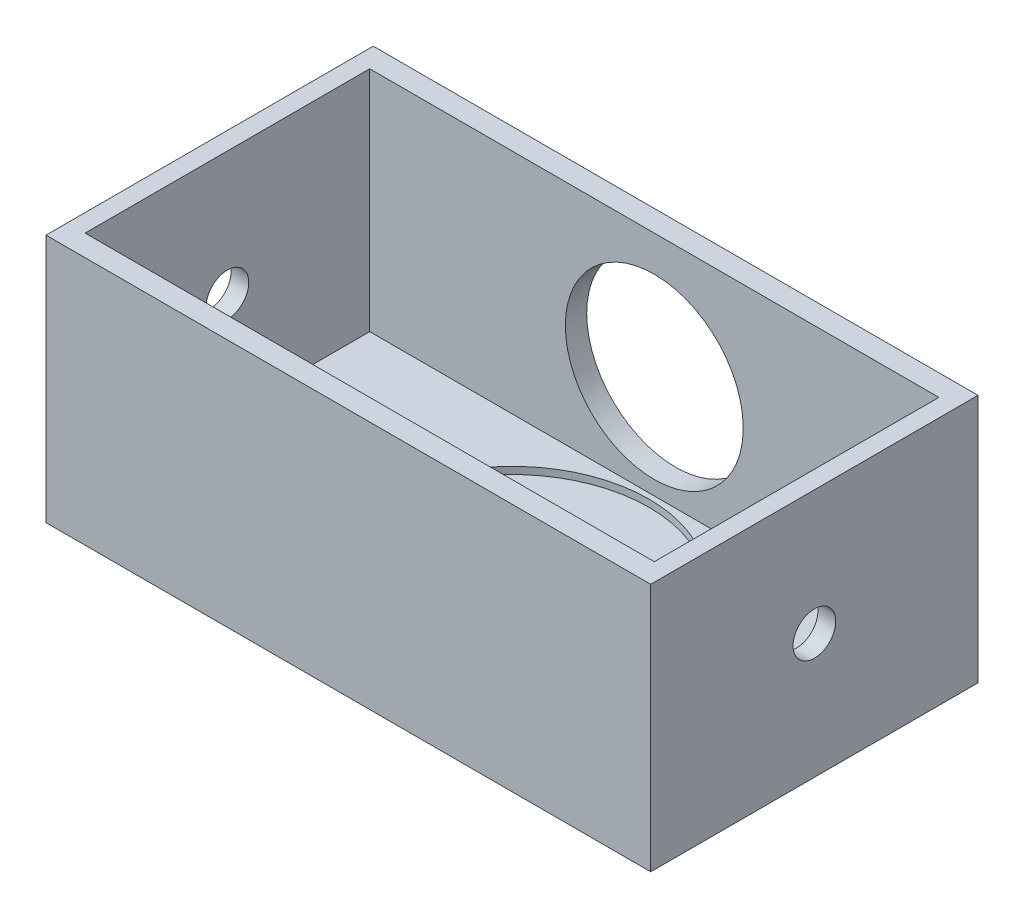
ISO-10303-21;
HEADER;
FILE_DESCRIPTION(('STEP AP214'),'2;1');
FILE_NAME('part.step','',(''),(''),'','','');
FILE_SCHEMA(('AUTOMOTIVE_DESIGN { 1 0 10303 214 1 1 1 1 }'));
ENDSEC;
DATA;
#1=APPLICATION_CONTEXT('core data for automotive mechanical design processes');
#2=APPLICATION_PROTOCOL_DEFINITION('international standard','automotive_design',2000,#1);
#3=PRODUCT_CONTEXT('',#1,'mechanical');
#4=PRODUCT('Part','Part','',(#3));
#5=PRODUCT_RELATED_PRODUCT_CATEGORY('part','',(#4));
#6=PRODUCT_DEFINITION_FORMATION('','',#4);
#7=PRODUCT_DEFINITION_CONTEXT('part definition',#1,'design');
#8=PRODUCT_DEFINITION('design','',#6,#7);
#9=PRODUCT_DEFINITION_SHAPE('','',#8);
#10=(LENGTH_UNIT() NAMED_UNIT(*) SI_UNIT(.MILLI.,.METRE.));
#11=(NAMED_UNIT(*) PLANE_ANGLE_UNIT() SI_UNIT($,.RADIAN.));
#12=(NAMED_UNIT(*) SI_UNIT($,.STERADIAN.) SOLID_ANGLE_UNIT());
#13=UNCERTAINTY_MEASURE_WITH_UNIT(LENGTH_MEASURE(1.E-05),#10,'distance_accuracy_value','');
#14=(GEOMETRIC_REPRESENTATION_CONTEXT(3) GLOBAL_UNCERTAINTY_ASSIGNED_CONTEXT((#13)) GLOBAL_UNIT_ASSIGNED_CONTEXT((#10,
#11,#12)) REPRESENTATION_CONTEXT('',''));
#15=CARTESIAN_POINT('',(0.,0.,0.));
#16=DIRECTION('',(0.,0.,1.));
#17=DIRECTION('',(1.,0.,0.));
#18=AXIS2_PLACEMENT_3D('',#15,#16,#17);
#19=CARTESIAN_POINT('',(-40.,0.,-20.));
#20=DIRECTION('',(0.,0.,-1.));
#21=DIRECTION('',(-1.,0.,0.));
#22=AXIS2_PLACEMENT_3D('',#19,#20,#21);
#23=PLANE('',#22);
#24=CARTESIAN_POINT('',(0.,17.5,-20.));
#25=DIRECTION('',(0.,0.,-1.));
#26=DIRECTION('',(-1.,0.,0.));
#27=AXIS2_PLACEMENT_3D('',#24,#25,#26);
#28=CIRCLE('',#27,12.5);
#29=CARTESIAN_POINT('',(-12.5,17.5,-20.));
#30=VERTEX_POINT('',#29);
#31=EDGE_CURVE('E43',#30,#30,#28,.F.);
#32=ORIENTED_EDGE('',*,*,#31,.F.);
#33=EDGE_LOOP('',(#32));
#34=FACE_BOUND('',#33,.T.);
#35=DIRECTION('',(-1.,0.,0.));
#36=VECTOR('',#35,1.);
#37=CARTESIAN_POINT('',(-40.,3.,-20.));
#38=LINE('',#37,#36);
#39=CARTESIAN_POINT('',(40.,3.,-20.));
#40=VERTEX_POINT('',#39);
#41=CARTESIAN_POINT('',(-40.,3.,-20.));
#42=VERTEX_POINT('',#41);
#43=EDGE_CURVE('E56',#40,#42,#38,.T.);
#44=ORIENTED_EDGE('',*,*,#43,.F.);
#45=DIRECTION('',(0.,1.,0.));
#46=VECTOR('',#45,1.);
#47=CARTESIAN_POINT('',(40.,0.,-20.));
#48=LINE('',#47,#46);
#49=CARTESIAN_POINT('',(40.,35.,-20.));
#50=VERTEX_POINT('',#49);
#51=EDGE_CURVE('E122',#40,#50,#48,.T.);
#52=ORIENTED_EDGE('',*,*,#51,.T.);
#53=DIRECTION('',(-1.,0.,0.));
#54=VECTOR('',#53,1.);
#55=CARTESIAN_POINT('',(-40.,35.,-20.));
#56=LINE('',#55,#54);
#57=CARTESIAN_POINT('',(-40.,35.,-20.));
#58=VERTEX_POINT('',#57);
#59=EDGE_CURVE('E129',#50,#58,#56,.T.);
#60=ORIENTED_EDGE('',*,*,#59,.T.);
#61=DIRECTION('',(0.,1.,0.));
#62=VECTOR('',#61,1.);
#63=CARTESIAN_POINT('',(-40.,0.,-20.));
#64=LINE('',#63,#62);
#65=EDGE_CURVE('E141',#42,#58,#64,.T.);
#66=ORIENTED_EDGE('',*,*,#65,.F.);
#67=EDGE_LOOP('',(#44,#52,#60,#66));
#68=FACE_BOUND('',#67,.T.);
#69=ADVANCED_FACE('F39',(#34,#68),#23,.F.);
#70=CARTESIAN_POINT('',(40.,0.,20.));
#71=DIRECTION('',(1.,0.,0.));
#72=DIRECTION('',(0.,0.,-1.));
#73=AXIS2_PLACEMENT_3D('',#70,#71,#72);
#74=PLANE('',#73);
#75=CARTESIAN_POINT('',(40.,17.5,0.));
#76=DIRECTION('',(1.,0.,0.));
#77=DIRECTION('',(0.,0.,-1.));
#78=AXIS2_PLACEMENT_3D('',#75,#76,#77);
#79=CIRCLE('',#78,3.);
#80=CARTESIAN_POINT('',(40.,17.5,-3.));
#81=VERTEX_POINT('',#80);
#82=EDGE_CURVE('E180',#81,#81,#79,.F.);
#83=ORIENTED_EDGE('',*,*,#82,.F.);
#84=EDGE_LOOP('',(#83));
#85=FACE_BOUND('',#84,.T.);
#86=DIRECTION('',(0.,0.,-1.));
#87=VECTOR('',#86,1.);
#88=CARTESIAN_POINT('',(40.,3.,20.));
#89=LINE('',#88,#87);
#90=CARTESIAN_POINT('',(40.,3.,20.));
#91=VERTEX_POINT('',#90);
#92=EDGE_CURVE('E120',#91,#40,#89,.T.);
#93=ORIENTED_EDGE('',*,*,#92,.F.);
#94=DIRECTION('',(0.,1.,0.));
#95=VECTOR('',#94,1.);
#96=CARTESIAN_POINT('',(40.,0.,20.));
#97=LINE('',#96,#95);
#98=CARTESIAN_POINT('',(40.,35.,20.));
#99=VERTEX_POINT('',#98);
#100=EDGE_CURVE('E106',#91,#99,#97,.T.);
#101=ORIENTED_EDGE('',*,*,#100,.T.);
#102=DIRECTION('',(0.,0.,-1.));
#103=VECTOR('',#102,1.);
#104=CARTESIAN_POINT('',(40.,35.,20.));
#105=LINE('',#104,#103);
#106=EDGE_CURVE('E127',#99,#50,#105,.T.);
#107=ORIENTED_EDGE('',*,*,#106,.T.);
#108=ORIENTED_EDGE('',*,*,#51,.F.);
#109=EDGE_LOOP('',(#93,#101,#107,#108));
#110=FACE_BOUND('',#109,.T.);
#111=ADVANCED_FACE('F121',(#85,#110),#74,.F.);
#112=CARTESIAN_POINT('',(-40.,0.,20.));
#113=DIRECTION('',(-1.,0.,0.));
#114=DIRECTION('',(0.,0.,1.));
#115=AXIS2_PLACEMENT_3D('',#112,#113,#114);
#116=PLANE('',#115);
#117=CARTESIAN_POINT('',(-40.,17.5,0.));
#118=DIRECTION('',(-1.,0.,0.));
#119=DIRECTION('',(0.,0.,1.));
#120=AXIS2_PLACEMENT_3D('',#117,#118,#119);
#121=CIRCLE('',#120,3.);
#122=CARTESIAN_POINT('',(-40.,17.5,3.));
#123=VERTEX_POINT('',#122);
#124=EDGE_CURVE('E116',#123,#123,#121,.F.);
#125=ORIENTED_EDGE('',*,*,#124,.F.);
#126=EDGE_LOOP('',(#125));
#127=FACE_BOUND('',#126,.T.);
#128=DIRECTION('',(0.,0.,1.));
#129=VECTOR('',#128,1.);
#130=CARTESIAN_POINT('',(-40.,3.,20.));
#131=LINE('',#130,#129);
#132=CARTESIAN_POINT('',(-40.,3.,20.));
#133=VERTEX_POINT('',#132);
#134=EDGE_CURVE('E64',#42,#133,#131,.T.);
#135=ORIENTED_EDGE('',*,*,#134,.F.);
#136=ORIENTED_EDGE('',*,*,#65,.T.);
#137=DIRECTION('',(0.,0.,1.));
#138=VECTOR('',#137,1.);
#139=CARTESIAN_POINT('',(-40.,35.,20.));
#140=LINE('',#139,#138);
#141=CARTESIAN_POINT('',(-40.,35.,20.));
#142=VERTEX_POINT('',#141);
#143=EDGE_CURVE('E136',#58,#142,#140,.T.);
#144=ORIENTED_EDGE('',*,*,#143,.T.);
#145=DIRECTION('',(0.,1.,0.));
#146=VECTOR('',#145,1.);
#147=CARTESIAN_POINT('',(-40.,0.,20.));
#148=LINE('',#147,#146);
#149=EDGE_CURVE('E117',#133,#142,#148,.T.);
#150=ORIENTED_EDGE('',*,*,#149,.F.);
#151=EDGE_LOOP('',(#135,#136,#144,#150));
#152=FACE_BOUND('',#151,.T.);
#153=ADVANCED_FACE('F195',(#127,#152),#116,.F.);
#154=CARTESIAN_POINT('',(-40.,0.,20.));
#155=DIRECTION('',(0.,0.,1.));
#156=DIRECTION('',(1.,0.,0.));
#157=AXIS2_PLACEMENT_3D('',#154,#155,#156);
#158=PLANE('',#157);
#159=DIRECTION('',(1.,0.,0.));
#160=VECTOR('',#159,1.);
#161=CARTESIAN_POINT('',(-40.,3.,20.));
#162=LINE('',#161,#160);
#163=EDGE_CURVE('E110',#133,#91,#162,.T.);
#164=ORIENTED_EDGE('',*,*,#163,.F.);
#165=ORIENTED_EDGE('',*,*,#149,.T.);
#166=DIRECTION('',(1.,0.,0.));
#167=VECTOR('',#166,1.);
#168=CARTESIAN_POINT('',(-40.,35.,20.));
#169=LINE('',#168,#167);
#170=EDGE_CURVE('E112',#142,#99,#169,.T.);
#171=ORIENTED_EDGE('',*,*,#170,.T.);
#172=ORIENTED_EDGE('',*,*,#100,.F.);
#173=EDGE_LOOP('',(#164,#165,#171,#172));
#174=FACE_BOUND('',#173,.T.);
#175=ADVANCED_FACE('F108',(#174),#158,.F.);
#176=CARTESIAN_POINT('',(-42.5,17.5,0.));
#177=DIRECTION('',(1.,0.,0.));
#178=DIRECTION('',(0.,0.,-1.));
#179=AXIS2_PLACEMENT_3D('',#176,#177,#178);
#180=CYLINDRICAL_SURFACE('',#179,3.);
#181=ORIENTED_EDGE('',*,*,#82,.T.);
#182=EDGE_LOOP('',(#181));
#183=FACE_BOUND('',#182,.T.);
#184=CARTESIAN_POINT('',(42.5,17.5,0.));
#185=DIRECTION('',(1.,0.,0.));
#186=DIRECTION('',(0.,0.,-1.));
#187=AXIS2_PLACEMENT_3D('',#184,#185,#186);
#188=CIRCLE('',#187,3.);
#189=CARTESIAN_POINT('',(42.5,17.5,-3.));
#190=VERTEX_POINT('',#189);
#191=EDGE_CURVE('E148',#190,#190,#188,.T.);
#192=ORIENTED_EDGE('',*,*,#191,.T.);
#193=EDGE_LOOP('',(#192));
#194=FACE_BOUND('',#193,.T.);
#195=ADVANCED_FACE('F205',(#183,#194),#180,.F.);
#196=CARTESIAN_POINT('',(42.5,35.,23.));
#197=DIRECTION('',(-1.,0.,0.));
#198=DIRECTION('',(0.,0.,1.));
#199=AXIS2_PLACEMENT_3D('',#196,#197,#198);
#200=PLANE('',#199);
#201=ORIENTED_EDGE('',*,*,#191,.F.);
#202=EDGE_LOOP('',(#201));
#203=FACE_BOUND('',#202,.T.);
#204=DIRECTION('',(0.,0.,-1.));
#205=VECTOR('',#204,1.);
#206=CARTESIAN_POINT('',(42.5,0.,23.));
#207=LINE('',#206,#205);
#208=CARTESIAN_POINT('',(42.5,0.,23.));
#209=VERTEX_POINT('',#208);
#210=CARTESIAN_POINT('',(42.5,0.,-23.));
#211=VERTEX_POINT('',#210);
#212=EDGE_CURVE('E153',#209,#211,#207,.T.);
#213=ORIENTED_EDGE('',*,*,#212,.T.);
#214=DIRECTION('',(0.,-1.,0.));
#215=VECTOR('',#214,1.);
#216=CARTESIAN_POINT('',(42.5,35.,-23.));
#217=LINE('',#216,#215);
#218=CARTESIAN_POINT('',(42.5,35.,-23.));
#219=VERTEX_POINT('',#218);
#220=EDGE_CURVE('E11',#219,#211,#217,.T.);
#221=ORIENTED_EDGE('',*,*,#220,.F.);
#222=DIRECTION('',(0.,0.,-1.));
#223=VECTOR('',#222,1.);
#224=CARTESIAN_POINT('',(42.5,35.,23.));
#225=LINE('',#224,#223);
#226=CARTESIAN_POINT('',(42.5,35.,23.));
#227=VERTEX_POINT('',#226);
#228=EDGE_CURVE('E154',#227,#219,#225,.T.);
#229=ORIENTED_EDGE('',*,*,#228,.F.);
#230=DIRECTION('',(0.,-1.,0.));
#231=VECTOR('',#230,1.);
#232=CARTESIAN_POINT('',(42.5,35.,23.));
#233=LINE('',#232,#231);
#234=EDGE_CURVE('E164',#227,#209,#233,.T.);
#235=ORIENTED_EDGE('',*,*,#234,.T.);
#236=EDGE_LOOP('',(#213,#221,#229,#235));
#237=FACE_BOUND('',#236,.T.);
#238=ADVANCED_FACE('F41',(#203,#237),#200,.F.);
#239=CARTESIAN_POINT('',(-42.5,35.,-23.));
#240=DIRECTION('',(0.,0.,1.));
#241=DIRECTION('',(1.,0.,0.));
#242=AXIS2_PLACEMENT_3D('',#239,#240,#241);
#243=PLANE('',#242);
#244=CARTESIAN_POINT('',(0.,17.5,-23.));
#245=DIRECTION('',(0.,0.,-1.));
#246=DIRECTION('',(-1.,0.,0.));
#247=AXIS2_PLACEMENT_3D('',#244,#245,#246);
#248=CIRCLE('',#247,12.5);
#249=CARTESIAN_POINT('',(-12.5,17.5,-23.));
#250=VERTEX_POINT('',#249);
#251=EDGE_CURVE('E147',#250,#250,#248,.T.);
#252=ORIENTED_EDGE('',*,*,#251,.F.);
#253=EDGE_LOOP('',(#252));
#254=FACE_BOUND('',#253,.T.);
#255=DIRECTION('',(-1.,0.,0.));
#256=VECTOR('',#255,1.);
#257=CARTESIAN_POINT('',(-42.5,0.,-23.));
#258=LINE('',#257,#256);
#259=CARTESIAN_POINT('',(-42.5,0.,-23.));
#260=VERTEX_POINT('',#259);
#261=EDGE_CURVE('E167',#211,#260,#258,.T.);
#262=ORIENTED_EDGE('',*,*,#261,.T.);
#263=DIRECTION('',(0.,-1.,0.));
#264=VECTOR('',#263,1.);
#265=CARTESIAN_POINT('',(-42.5,35.,-23.));
#266=LINE('',#265,#264);
#267=CARTESIAN_POINT('',(-42.5,35.,-23.));
#268=VERTEX_POINT('',#267);
#269=EDGE_CURVE('E48',#268,#260,#266,.T.);
#270=ORIENTED_EDGE('',*,*,#269,.F.);
#271=DIRECTION('',(-1.,0.,0.));
#272=VECTOR('',#271,1.);
#273=CARTESIAN_POINT('',(-42.5,35.,-23.));
#274=LINE('',#273,#272);
#275=EDGE_CURVE('E157',#219,#268,#274,.T.);
#276=ORIENTED_EDGE('',*,*,#275,.F.);
#277=ORIENTED_EDGE('',*,*,#220,.T.);
#278=EDGE_LOOP('',(#262,#270,#276,#277));
#279=FACE_BOUND('',#278,.T.);
#280=ADVANCED_FACE('F222',(#254,#279),#243,.F.);
#281=CARTESIAN_POINT('',(-42.5,35.,23.));
#282=DIRECTION('',(1.,0.,0.));
#283=DIRECTION('',(0.,0.,-1.));
#284=AXIS2_PLACEMENT_3D('',#281,#282,#283);
#285=PLANE('',#284);
#286=CARTESIAN_POINT('',(-42.5,17.5,0.));
#287=DIRECTION('',(1.,0.,0.));
#288=DIRECTION('',(0.,0.,-1.));
#289=AXIS2_PLACEMENT_3D('',#286,#287,#288);
#290=CIRCLE('',#289,3.);
#291=CARTESIAN_POINT('',(-42.5,17.5,-3.));
#292=VERTEX_POINT('',#291);
#293=EDGE_CURVE('E144',#292,#292,#290,.T.);
#294=ORIENTED_EDGE('',*,*,#293,.T.);
#295=EDGE_LOOP('',(#294));
#296=FACE_BOUND('',#295,.T.);
#297=DIRECTION('',(0.,0.,1.));
#298=VECTOR('',#297,1.);
#299=CARTESIAN_POINT('',(-42.5,0.,23.));
#300=LINE('',#299,#298);
#301=CARTESIAN_POINT('',(-42.5,0.,23.));
#302=VERTEX_POINT('',#301);
#303=EDGE_CURVE('E169',#260,#302,#300,.T.);
#304=ORIENTED_EDGE('',*,*,#303,.T.);
#305=DIRECTION('',(0.,-1.,0.));
#306=VECTOR('',#305,1.);
#307=CARTESIAN_POINT('',(-42.5,35.,23.));
#308=LINE('',#307,#306);
#309=CARTESIAN_POINT('',(-42.5,35.,23.));
#310=VERTEX_POINT('',#309);
#311=EDGE_CURVE('E174',#310,#302,#308,.T.);
#312=ORIENTED_EDGE('',*,*,#311,.F.);
#313=DIRECTION('',(0.,0.,1.));
#314=VECTOR('',#313,1.);
#315=CARTESIAN_POINT('',(-42.5,35.,23.));
#316=LINE('',#315,#314);
#317=EDGE_CURVE('E160',#268,#310,#316,.T.);
#318=ORIENTED_EDGE('',*,*,#317,.F.);
#319=ORIENTED_EDGE('',*,*,#269,.T.);
#320=EDGE_LOOP('',(#304,#312,#318,#319));
#321=FACE_BOUND('',#320,.T.);
#322=ADVANCED_FACE('F219',(#296,#321),#285,.F.);
#323=CARTESIAN_POINT('',(-42.5,35.,23.));
#324=DIRECTION('',(0.,0.,-1.));
#325=DIRECTION('',(-1.,0.,0.));
#326=AXIS2_PLACEMENT_3D('',#323,#324,#325);
#327=PLANE('',#326);
#328=DIRECTION('',(1.,0.,0.));
#329=VECTOR('',#328,1.);
#330=CARTESIAN_POINT('',(-42.5,0.,23.));
#331=LINE('',#330,#329);
#332=EDGE_CURVE('E158',#302,#209,#331,.T.);
#333=ORIENTED_EDGE('',*,*,#332,.T.);
#334=ORIENTED_EDGE('',*,*,#234,.F.);
#335=DIRECTION('',(1.,0.,0.));
#336=VECTOR('',#335,1.);
#337=CARTESIAN_POINT('',(-42.5,35.,23.));
#338=LINE('',#337,#336);
#339=EDGE_CURVE('E162',#310,#227,#338,.T.);
#340=ORIENTED_EDGE('',*,*,#339,.F.);
#341=ORIENTED_EDGE('',*,*,#311,.T.);
#342=EDGE_LOOP('',(#333,#334,#340,#341));
#343=FACE_BOUND('',#342,.T.);
#344=ADVANCED_FACE('F212',(#343),#327,.F.);
#345=CARTESIAN_POINT('',(0.,35.,0.));
#346=DIRECTION('',(0.,-1.,0.));
#347=DIRECTION('',(0.,0.,-1.));
#348=AXIS2_PLACEMENT_3D('',#345,#346,#347);
#349=PLANE('',#348);
#350=ORIENTED_EDGE('',*,*,#59,.F.);
#351=ORIENTED_EDGE('',*,*,#106,.F.);
#352=ORIENTED_EDGE('',*,*,#170,.F.);
#353=ORIENTED_EDGE('',*,*,#143,.F.);
#354=EDGE_LOOP('',(#350,#351,#352,#353));
#355=FACE_BOUND('',#354,.T.);
#356=ORIENTED_EDGE('',*,*,#228,.T.);
#357=ORIENTED_EDGE('',*,*,#275,.T.);
#358=ORIENTED_EDGE('',*,*,#317,.T.);
#359=ORIENTED_EDGE('',*,*,#339,.T.);
#360=EDGE_LOOP('',(#356,#357,#358,#359));
#361=FACE_BOUND('',#360,.T.);
#362=ADVANCED_FACE('F209',(#355,#361),#349,.F.);
#363=CARTESIAN_POINT('',(0.,0.,0.));
#364=DIRECTION('',(0.,-1.,0.));
#365=DIRECTION('',(0.,0.,-1.));
#366=AXIS2_PLACEMENT_3D('',#363,#364,#365);
#367=PLANE('',#366);
#368=ORIENTED_EDGE('',*,*,#212,.F.);
#369=ORIENTED_EDGE('',*,*,#332,.F.);
#370=ORIENTED_EDGE('',*,*,#303,.F.);
#371=ORIENTED_EDGE('',*,*,#261,.F.);
#372=EDGE_LOOP('',(#368,#369,#370,#371));
#373=FACE_BOUND('',#372,.T.);
#374=ADVANCED_FACE('F208',(#373),#367,.T.);
#375=CARTESIAN_POINT('',(0.,17.5,-13.));
#376=DIRECTION('',(0.,0.,-1.));
#377=DIRECTION('',(-1.,0.,0.));
#378=AXIS2_PLACEMENT_3D('',#375,#376,#377);
#379=CYLINDRICAL_SURFACE('',#378,12.5);
#380=ORIENTED_EDGE('',*,*,#31,.T.);
#381=EDGE_LOOP('',(#380));
#382=FACE_BOUND('',#381,.T.);
#383=ORIENTED_EDGE('',*,*,#251,.T.);
#384=EDGE_LOOP('',(#383));
#385=FACE_BOUND('',#384,.T.);
#386=ADVANCED_FACE('F187',(#382,#385),#379,.F.);
#387=ORIENTED_EDGE('',*,*,#124,.T.);
#388=EDGE_LOOP('',(#387));
#389=FACE_BOUND('',#388,.T.);
#390=ORIENTED_EDGE('',*,*,#293,.F.);
#391=EDGE_LOOP('',(#390));
#392=FACE_BOUND('',#391,.T.);
#393=ADVANCED_FACE('F201',(#389,#392),#180,.F.);
#394=CARTESIAN_POINT('',(0.,3.,0.));
#395=DIRECTION('',(0.,-1.,0.));
#396=DIRECTION('',(0.,0.,-1.));
#397=AXIS2_PLACEMENT_3D('',#394,#395,#396);
#398=PLANE('',#397);
#399=CARTESIAN_POINT('',(0.,3.,0.));
#400=DIRECTION('',(0.,1.,0.));
#401=DIRECTION('',(0.,0.,1.));
#402=AXIS2_PLACEMENT_3D('',#399,#400,#401);
#403=CIRCLE('',#402,19.25);
#404=CARTESIAN_POINT('',(0.,3.,19.25));
#405=VERTEX_POINT('',#404);
#406=EDGE_CURVE('E285',#405,#405,#403,.T.);
#407=ORIENTED_EDGE('',*,*,#406,.F.);
#408=EDGE_LOOP('',(#407));
#409=FACE_BOUND('',#408,.T.);
#410=ORIENTED_EDGE('',*,*,#92,.T.);
#411=ORIENTED_EDGE('',*,*,#43,.T.);
#412=ORIENTED_EDGE('',*,*,#134,.T.);
#413=ORIENTED_EDGE('',*,*,#163,.T.);
#414=EDGE_LOOP('',(#410,#411,#412,#413));
#415=FACE_BOUND('',#414,.T.);
#416=ADVANCED_FACE('F126',(#409,#415),#398,.F.);
#417=CARTESIAN_POINT('',(0.,2.,0.));
#418=DIRECTION('',(0.,1.,0.));
#419=DIRECTION('',(0.,0.,1.));
#420=AXIS2_PLACEMENT_3D('',#417,#418,#419);
#421=CYLINDRICAL_SURFACE('',#420,19.25);
#422=CARTESIAN_POINT('',(0.,2.,0.));
#423=DIRECTION('',(0.,1.,0.));
#424=DIRECTION('',(0.,0.,1.));
#425=AXIS2_PLACEMENT_3D('',#422,#423,#424);
#426=CIRCLE('',#425,19.25);
#427=CARTESIAN_POINT('',(0.,2.,19.25));
#428=VERTEX_POINT('',#427);
#429=EDGE_CURVE('E124',#428,#428,#426,.T.);
#430=ORIENTED_EDGE('',*,*,#429,.F.);
#431=EDGE_LOOP('',(#430));
#432=FACE_BOUND('',#431,.T.);
#433=ORIENTED_EDGE('',*,*,#406,.T.);
#434=EDGE_LOOP('',(#433));
#435=FACE_BOUND('',#434,.T.);
#436=ADVANCED_FACE('F260',(#432,#435),#421,.F.);
#437=CARTESIAN_POINT('',(0.,2.,0.));
#438=DIRECTION('',(0.,1.,0.));
#439=DIRECTION('',(0.,0.,1.));
#440=AXIS2_PLACEMENT_3D('',#437,#438,#439);
#441=PLANE('',#440);
#442=CARTESIAN_POINT('',(0.,2.,0.));
#443=DIRECTION('',(0.,1.,0.));
#444=DIRECTION('',(0.,0.,1.));
#445=AXIS2_PLACEMENT_3D('',#442,#443,#444);
#446=CIRCLE('',#445,1.875);
#447=CARTESIAN_POINT('',(0.,2.,1.875));
#448=VERTEX_POINT('',#447);
#449=EDGE_CURVE('E282',#448,#448,#446,.T.);
#450=ORIENTED_EDGE('',*,*,#449,.F.);
#451=EDGE_LOOP('',(#450));
#452=FACE_BOUND('',#451,.T.);
#453=ORIENTED_EDGE('',*,*,#429,.T.);
#454=EDGE_LOOP('',(#453));
#455=FACE_BOUND('',#454,.T.);
#456=ADVANCED_FACE('F264',(#452,#455),#441,.T.);
#457=CARTESIAN_POINT('',(0.,2.,0.));
#458=DIRECTION('',(0.,1.,0.));
#459=DIRECTION('',(0.,0.,1.));
#460=AXIS2_PLACEMENT_3D('',#457,#458,#459);
#461=CYLINDRICAL_SURFACE('',#460,1.875);
#462=ORIENTED_EDGE('',*,*,#449,.T.);
#463=EDGE_LOOP('',(#462));
#464=FACE_BOUND('',#463,.T.);
#465=CARTESIAN_POINT('',(0.,8.,0.));
#466=DIRECTION('',(0.,1.,0.));
#467=DIRECTION('',(0.,0.,1.));
#468=AXIS2_PLACEMENT_3D('',#465,#466,#467);
#469=CIRCLE('',#468,1.875);
#470=CARTESIAN_POINT('',(0.,8.,1.875));
#471=VERTEX_POINT('',#470);
#472=EDGE_CURVE('E280',#471,#471,#469,.T.);
#473=ORIENTED_EDGE('',*,*,#472,.F.);
#474=EDGE_LOOP('',(#473));
#475=FACE_BOUND('',#474,.T.);
#476=ADVANCED_FACE('F268',(#464,#475),#461,.T.);
#477=CARTESIAN_POINT('',(0.,8.,0.));
#478=DIRECTION('',(0.,1.,0.));
#479=DIRECTION('',(0.,0.,1.));
#480=AXIS2_PLACEMENT_3D('',#477,#478,#479);
#481=PLANE('',#480);
#482=ORIENTED_EDGE('',*,*,#472,.T.);
#483=EDGE_LOOP('',(#482));
#484=FACE_BOUND('',#483,.T.);
#485=ADVANCED_FACE('F272',(#484),#481,.T.);
#486=CLOSED_SHELL('',(#69,#111,#153,#175,#195,#238,#280,#322,#344,#362,#374,#386,#393,#416,#436,
#456,#476,#485));
#487=MANIFOLD_SOLID_BREP('B2',#486);
#488=ADVANCED_BREP_SHAPE_REPRESENTATION('',(#18,#487),#14);
#489=SHAPE_DEFINITION_REPRESENTATION(#9,#488);
ENDSEC;
END-ISO-10303-21;
